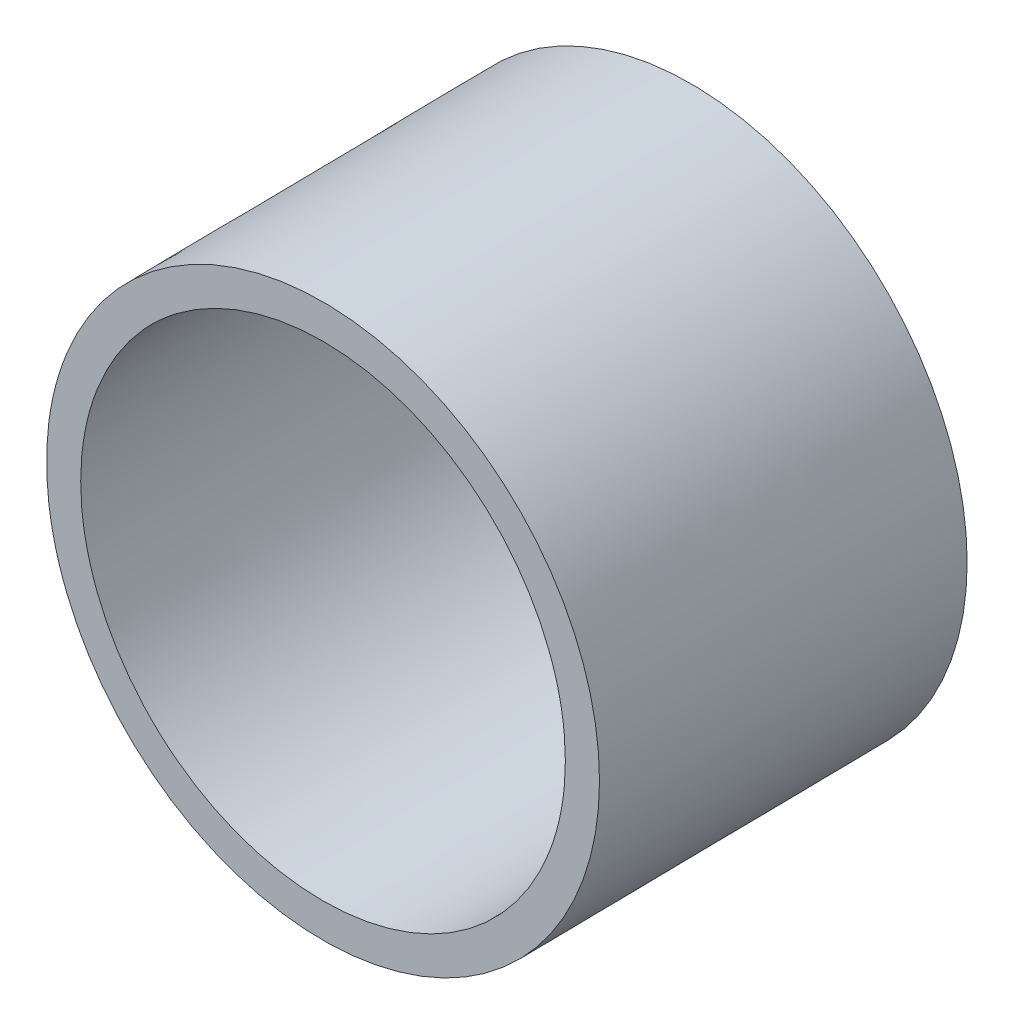
ISO-10303-21;
HEADER;
FILE_DESCRIPTION(('STEP AP214'),'2;1');
FILE_NAME('part.step','',(''),(''),'','','');
FILE_SCHEMA(('AUTOMOTIVE_DESIGN { 1 0 10303 214 1 1 1 1 }'));
ENDSEC;
DATA;
#1=APPLICATION_CONTEXT('core data for automotive mechanical design processes');
#2=APPLICATION_PROTOCOL_DEFINITION('international standard','automotive_design',2000,#1);
#3=PRODUCT_CONTEXT('',#1,'mechanical');
#4=PRODUCT('Part','Part','',(#3));
#5=PRODUCT_RELATED_PRODUCT_CATEGORY('part','',(#4));
#6=PRODUCT_DEFINITION_FORMATION('','',#4);
#7=PRODUCT_DEFINITION_CONTEXT('part definition',#1,'design');
#8=PRODUCT_DEFINITION('design','',#6,#7);
#9=PRODUCT_DEFINITION_SHAPE('','',#8);
#10=(LENGTH_UNIT() NAMED_UNIT(*) SI_UNIT(.MILLI.,.METRE.));
#11=(NAMED_UNIT(*) PLANE_ANGLE_UNIT() SI_UNIT($,.RADIAN.));
#12=(NAMED_UNIT(*) SI_UNIT($,.STERADIAN.) SOLID_ANGLE_UNIT());
#13=UNCERTAINTY_MEASURE_WITH_UNIT(LENGTH_MEASURE(1.E-05),#10,'distance_accuracy_value','');
#14=(GEOMETRIC_REPRESENTATION_CONTEXT(3) GLOBAL_UNCERTAINTY_ASSIGNED_CONTEXT((#13)) GLOBAL_UNIT_ASSIGNED_CONTEXT((#10,
#11,#12)) REPRESENTATION_CONTEXT('',''));
#15=CARTESIAN_POINT('',(0.,0.,0.));
#16=DIRECTION('',(0.,0.,1.));
#17=DIRECTION('',(1.,0.,0.));
#18=AXIS2_PLACEMENT_3D('',#15,#16,#17);
#19=CARTESIAN_POINT('',(0.,-0.847223824919752,59.1136319419832));
#20=DIRECTION('',(0.,0.,1.));
#21=DIRECTION('',(1.,0.,0.));
#22=AXIS2_PLACEMENT_3D('',#19,#20,#21);
#23=PLANE('',#22);
#24=CARTESIAN_POINT('',(0.,-0.847223824919752,59.1136319419832));
#25=DIRECTION('',(0.,0.,1.));
#26=DIRECTION('',(1.,0.,0.));
#27=AXIS2_PLACEMENT_3D('',#24,#25,#26);
#28=CIRCLE('',#27,38.9636);
#29=CARTESIAN_POINT('',(38.9636,-0.847223824919752,59.1136319419832));
#30=VERTEX_POINT('',#29);
#31=EDGE_CURVE('E51',#30,#30,#28,.T.);
#32=ORIENTED_EDGE('',*,*,#31,.F.);
#33=EDGE_LOOP('',(#32));
#34=FACE_BOUND('',#33,.T.);
#35=CARTESIAN_POINT('',(0.,-0.847223824919752,59.1136319419832));
#36=DIRECTION('',(0.,0.,1.));
#37=DIRECTION('',(1.,0.,0.));
#38=AXIS2_PLACEMENT_3D('',#35,#36,#37);
#39=CIRCLE('',#38,44.45);
#40=CARTESIAN_POINT('',(44.45,-0.847223824919752,59.1136319419832));
#41=VERTEX_POINT('',#40);
#42=EDGE_CURVE('E47',#41,#41,#39,.T.);
#43=ORIENTED_EDGE('',*,*,#42,.T.);
#44=EDGE_LOOP('',(#43));
#45=FACE_BOUND('',#44,.T.);
#46=ADVANCED_FACE('F36',(#34,#45),#23,.T.);
#47=CARTESIAN_POINT('',(0.,0.,0.));
#48=DIRECTION('',(0.,0.,1.));
#49=DIRECTION('',(1.,0.,0.));
#50=AXIS2_PLACEMENT_3D('',#47,#48,#49);
#51=PLANE('',#50);
#52=CARTESIAN_POINT('',(0.,0.,0.));
#53=DIRECTION('',(0.,0.,1.));
#54=DIRECTION('',(1.,0.,0.));
#55=AXIS2_PLACEMENT_3D('',#52,#53,#54);
#56=CIRCLE('',#55,38.9636);
#57=CARTESIAN_POINT('',(38.9636,0.,0.));
#58=VERTEX_POINT('',#57);
#59=EDGE_CURVE('E43',#58,#58,#56,.T.);
#60=ORIENTED_EDGE('',*,*,#59,.T.);
#61=EDGE_LOOP('',(#60));
#62=FACE_BOUND('',#61,.T.);
#63=CARTESIAN_POINT('',(0.,0.,0.));
#64=DIRECTION('',(0.,0.,1.));
#65=DIRECTION('',(1.,0.,0.));
#66=AXIS2_PLACEMENT_3D('',#63,#64,#65);
#67=CIRCLE('',#66,44.45);
#68=CARTESIAN_POINT('',(44.45,0.,0.));
#69=VERTEX_POINT('',#68);
#70=EDGE_CURVE('E10',#69,#69,#67,.T.);
#71=ORIENTED_EDGE('',*,*,#70,.F.);
#72=EDGE_LOOP('',(#71));
#73=FACE_BOUND('',#72,.T.);
#74=ADVANCED_FACE('F38',(#62,#73),#51,.F.);
#75=CARTESIAN_POINT('',(44.45,0.,0.));
#76=CARTESIAN_POINT('',(44.45,-0.847223824919752,59.1136319419832));
#77=CARTESIAN_POINT('',(44.45,-88.9,0.));
#78=CARTESIAN_POINT('',(44.45,-89.7472238249197,59.1136319419832));
#79=CARTESIAN_POINT('',(-44.45,-88.9,0.));
#80=CARTESIAN_POINT('',(-44.45,-89.7472238249197,59.1136319419832));
#81=CARTESIAN_POINT('',(-44.45,0.,0.));
#82=CARTESIAN_POINT('',(-44.45,-0.847223824919746,59.1136319419832));
#83=CARTESIAN_POINT('',(-44.45,88.9,0.));
#84=CARTESIAN_POINT('',(-44.45,88.0527761750802,59.1136319419832));
#85=CARTESIAN_POINT('',(44.45,88.9,0.));
#86=CARTESIAN_POINT('',(44.45,88.0527761750802,59.1136319419832));
#87=CARTESIAN_POINT('',(44.45,0.,0.));
#88=CARTESIAN_POINT('',(44.45,-0.847223824919752,59.1136319419832));
#89=(BOUNDED_SURFACE() B_SPLINE_SURFACE(3,1,((#75,#76),(#77,#78),(#79,#80),(#81,#82),(#83,#84),
(#85,#86),(#87,#88)),.UNSPECIFIED.,.T.,.F.,.F.) B_SPLINE_SURFACE_WITH_KNOTS((4,3,4),(2,2),(0.,
0.5,1.),(0.,1.),.UNSPECIFIED.) GEOMETRIC_REPRESENTATION_ITEM() RATIONAL_B_SPLINE_SURFACE(((1.,
1.),(0.333333333333333,0.333333333333333),(0.333333333333333,0.333333333333333),(1.,1.),
(0.333333333333333,0.333333333333333),(0.333333333333333,0.333333333333333),(1.,1.))) REPRESENTATION_ITEM('') SURFACE());
#90=CARTESIAN_POINT('',(44.45,0.,0.));
#91=CARTESIAN_POINT('',(44.45,-0.00882524817624742,0.615766999395658));
#92=CARTESIAN_POINT('',(44.45,-0.0176504963524948,1.23153399879132));
#93=CARTESIAN_POINT('',(44.45,-0.0353009927049897,2.46306799758263));
#94=CARTESIAN_POINT('',(44.45,-0.0441262408812371,3.07883499697829));
#95=CARTESIAN_POINT('',(44.45,-0.0617767372337319,4.31036899576961));
#96=CARTESIAN_POINT('',(44.45,-0.0706019854099793,4.92613599516526));
#97=CARTESIAN_POINT('',(44.45,-0.0882524817624741,6.15766999395658));
#98=CARTESIAN_POINT('',(44.45,-0.0970777299387215,6.77343699335224));
#99=CARTESIAN_POINT('',(44.45,-0.114728226291216,8.00497099214355));
#100=CARTESIAN_POINT('',(44.45,-0.123553474467464,8.62073799153921));
#101=CARTESIAN_POINT('',(44.45,-0.141203970819959,9.85227199033053));
#102=CARTESIAN_POINT('',(44.45,-0.150029218996206,10.4680389897262));
#103=CARTESIAN_POINT('',(44.45,-0.167679715348701,11.6995729885175));
#104=CARTESIAN_POINT('',(44.45,-0.176504963524948,12.3153399879132));
#105=CARTESIAN_POINT('',(44.45,-0.194155459877443,13.5468739867045));
#106=CARTESIAN_POINT('',(44.45,-0.202980708053691,14.1626409861001));
#107=CARTESIAN_POINT('',(44.45,-0.220631204406185,15.3941749848914));
#108=CARTESIAN_POINT('',(44.45,-0.229456452582433,16.0099419842871));
#109=CARTESIAN_POINT('',(44.45,-0.247106948934928,17.2414759830784));
#110=CARTESIAN_POINT('',(44.45,-0.255932197111175,17.8572429824741));
#111=CARTESIAN_POINT('',(44.45,-0.27358269346367,19.0887769812654));
#112=CARTESIAN_POINT('',(44.45,-0.282407941639917,19.7045439806611));
#113=CARTESIAN_POINT('',(44.45,-0.300058437992412,20.9360779794524));
#114=CARTESIAN_POINT('',(44.45,-0.308883686168659,21.551844978848));
#115=CARTESIAN_POINT('',(44.45,-0.326534182521154,22.7833789776393));
#116=CARTESIAN_POINT('',(44.45,-0.335359430697402,23.399145977035));
#117=CARTESIAN_POINT('',(44.45,-0.353009927049897,24.6306799758263));
#118=CARTESIAN_POINT('',(44.45,-0.361835175226144,25.246446975222));
#119=CARTESIAN_POINT('',(44.45,-0.379485671578639,26.4779809740133));
#120=CARTESIAN_POINT('',(44.45,-0.388310919754886,27.0937479734089));
#121=CARTESIAN_POINT('',(44.45,-0.405961416107381,28.3252819722003));
#122=CARTESIAN_POINT('',(44.45,-0.414786664283628,28.9410489715959));
#123=CARTESIAN_POINT('',(44.45,-0.432437160636123,30.1725829703872));
#124=CARTESIAN_POINT('',(44.45,-0.441262408812371,30.7883499697829));
#125=CARTESIAN_POINT('',(44.45,-0.458912905164865,32.0198839685742));
#126=CARTESIAN_POINT('',(44.45,-0.467738153341113,32.6356509679699));
#127=CARTESIAN_POINT('',(44.45,-0.485388649693608,33.8671849667612));
#128=CARTESIAN_POINT('',(44.45,-0.494213897869855,34.4829519661568));
#129=CARTESIAN_POINT('',(44.45,-0.51186439422235,35.7144859649482));
#130=CARTESIAN_POINT('',(44.45,-0.520689642398597,36.3302529643438));
#131=CARTESIAN_POINT('',(44.45,-0.538340138751092,37.5617869631351));
#132=CARTESIAN_POINT('',(44.45,-0.54716538692734,38.1775539625308));
#133=CARTESIAN_POINT('',(44.45,-0.564815883279834,39.4090879613221));
#134=CARTESIAN_POINT('',(44.45,-0.573641131456082,40.0248549607178));
#135=CARTESIAN_POINT('',(44.45,-0.591291627808577,41.2563889595091));
#136=CARTESIAN_POINT('',(44.45,-0.600116875984824,41.8721559589047));
#137=CARTESIAN_POINT('',(44.45,-0.617767372337319,43.1036899576961));
#138=CARTESIAN_POINT('',(44.45,-0.626592620513566,43.7194569570917));
#139=CARTESIAN_POINT('',(44.45,-0.644243116866061,44.950990955883));
#140=CARTESIAN_POINT('',(44.45,-0.653068365042309,45.5667579552787));
#141=CARTESIAN_POINT('',(44.45,-0.670718861394803,46.79829195407));
#142=CARTESIAN_POINT('',(44.45,-0.679544109571051,47.4140589534657));
#143=CARTESIAN_POINT('',(44.45,-0.697194605923546,48.645592952257));
#144=CARTESIAN_POINT('',(44.45,-0.706019854099793,49.2613599516526));
#145=CARTESIAN_POINT('',(44.45,-0.723670350452288,50.4928939504439));
#146=CARTESIAN_POINT('',(44.45,-0.732495598628535,51.1086609498396));
#147=CARTESIAN_POINT('',(44.45,-0.75014609498103,52.3401949486309));
#148=CARTESIAN_POINT('',(44.45,-0.758971343157278,52.9559619480266));
#149=CARTESIAN_POINT('',(44.45,-0.776621839509772,54.1874959468179));
#150=CARTESIAN_POINT('',(44.45,-0.78544708768602,54.8032629462136));
#151=CARTESIAN_POINT('',(44.45,-0.803097584038515,56.0347969450049));
#152=CARTESIAN_POINT('',(44.45,-0.811922832214762,56.6505639444005));
#153=CARTESIAN_POINT('',(44.45,-0.829573328567257,57.8820979431918));
#154=CARTESIAN_POINT('',(44.45,-0.838398576743504,58.4978649425875));
#155=CARTESIAN_POINT('',(44.45,-0.847223824919752,59.1136319419832));
#156=B_SPLINE_CURVE_WITH_KNOTS('',3,(#90,#91,#92,#93,#94,#95,#96,#97,#98,#99,#100,#101,#102,
#103,#104,#105,#106,#107,#108,#109,#110,#111,#112,#113,#114,#115,#116,#117,#118,#119,#120,#121,
#122,#123,#124,#125,#126,#127,#128,#129,#130,#131,#132,#133,#134,#135,#136,#137,#138,#139,#140,
#141,#142,#143,#144,#145,#146,#147,#148,#149,#150,#151,#152,#153,#154,#155),.UNSPECIFIED.,.F.,
.F.,(4,2,2,2,2,2,2,2,2,2,2,2,2,2,2,2,2,2,2,2,2,2,2,2,2,2,2,2,2,2,2,2,4),(0.,1.84749071525433,
3.69498143050865,5.54247214576298,7.3899628610173,9.23745357627163,11.084944291526,
12.9324350067803,14.7799257220346,16.6274164372889,18.4749071525433,20.3223978677976,
22.1698885830519,24.0173792983062,25.8648700135606,27.7123607288149,29.5598514440692,
31.4073421593235,33.2548328745779,35.1023235898322,36.9498143050865,38.7973050203408,
40.6447957355952,42.4922864508495,44.3397771661038,46.1872678813582,48.0347585966125,
49.8822493118668,51.7297400271211,53.5772307423755,55.4247214576298,57.2722121728841,
59.1197028881385),.UNSPECIFIED.);
#157=EDGE_CURVE('BSEAM64',#69,#41,#156,.T.);
#158=ORIENTED_EDGE('',*,*,#70,.T.);
#159=ORIENTED_EDGE('',*,*,#42,.F.);
#160=ORIENTED_EDGE('',*,*,#157,.T.);
#161=ORIENTED_EDGE('',*,*,#157,.F.);
#162=EDGE_LOOP('',(#158,#160,#159,#161));
#163=FACE_BOUND('',#162,.T.);
#164=ADVANCED_FACE('F64',(#163),#89,.F.);
#165=CARTESIAN_POINT('',(38.9636,0.,0.));
#166=CARTESIAN_POINT('',(38.9636,-0.847223824919752,59.1136319419832));
#167=CARTESIAN_POINT('',(38.9636,-77.9272,0.));
#168=CARTESIAN_POINT('',(38.9636,-78.7744238249197,59.1136319419832));
#169=CARTESIAN_POINT('',(-38.9636,-77.9272,0.));
#170=CARTESIAN_POINT('',(-38.9636,-78.7744238249197,59.1136319419832));
#171=CARTESIAN_POINT('',(-38.9636,0.,0.));
#172=CARTESIAN_POINT('',(-38.9636,-0.847223824919747,59.1136319419832));
#173=CARTESIAN_POINT('',(-38.9636,77.9272,0.));
#174=CARTESIAN_POINT('',(-38.9636,77.0799761750802,59.1136319419832));
#175=CARTESIAN_POINT('',(38.9636,77.9272,0.));
#176=CARTESIAN_POINT('',(38.9636,77.0799761750802,59.1136319419832));
#177=CARTESIAN_POINT('',(38.9636,0.,0.));
#178=CARTESIAN_POINT('',(38.9636,-0.847223824919752,59.1136319419832));
#179=(BOUNDED_SURFACE() B_SPLINE_SURFACE(3,1,((#165,#166),(#167,#168),(#169,#170),(#171,#172),
(#173,#174),(#175,#176),(#177,#178)),.UNSPECIFIED.,.T.,.F.,.F.) B_SPLINE_SURFACE_WITH_KNOTS((4,
3,4),(2,2),(0.,0.5,1.),(0.,1.),
.UNSPECIFIED.) GEOMETRIC_REPRESENTATION_ITEM() RATIONAL_B_SPLINE_SURFACE(((1.,1.),
(0.333333333333333,0.333333333333333),(0.333333333333333,0.333333333333333),(1.,1.),
(0.333333333333333,0.333333333333333),(0.333333333333333,0.333333333333333),(1.,1.))) REPRESENTATION_ITEM('') SURFACE());
#180=CARTESIAN_POINT('',(38.9636,0.,0.));
#181=CARTESIAN_POINT('',(38.9636,-0.00882524817624742,0.615766999395658));
#182=CARTESIAN_POINT('',(38.9636,-0.0176504963524948,1.23153399879132));
#183=CARTESIAN_POINT('',(38.9636,-0.0353009927049897,2.46306799758263));
#184=CARTESIAN_POINT('',(38.9636,-0.0441262408812371,3.07883499697829));
#185=CARTESIAN_POINT('',(38.9636,-0.0617767372337319,4.31036899576961));
#186=CARTESIAN_POINT('',(38.9636,-0.0706019854099793,4.92613599516526));
#187=CARTESIAN_POINT('',(38.9636,-0.0882524817624741,6.15766999395658));
#188=CARTESIAN_POINT('',(38.9636,-0.0970777299387215,6.77343699335224));
#189=CARTESIAN_POINT('',(38.9636,-0.114728226291216,8.00497099214355));
#190=CARTESIAN_POINT('',(38.9636,-0.123553474467464,8.62073799153921));
#191=CARTESIAN_POINT('',(38.9636,-0.141203970819959,9.85227199033053));
#192=CARTESIAN_POINT('',(38.9636,-0.150029218996206,10.4680389897262));
#193=CARTESIAN_POINT('',(38.9636,-0.167679715348701,11.6995729885175));
#194=CARTESIAN_POINT('',(38.9636,-0.176504963524948,12.3153399879132));
#195=CARTESIAN_POINT('',(38.9636,-0.194155459877443,13.5468739867045));
#196=CARTESIAN_POINT('',(38.9636,-0.202980708053691,14.1626409861001));
#197=CARTESIAN_POINT('',(38.9636,-0.220631204406185,15.3941749848914));
#198=CARTESIAN_POINT('',(38.9636,-0.229456452582433,16.0099419842871));
#199=CARTESIAN_POINT('',(38.9636,-0.247106948934928,17.2414759830784));
#200=CARTESIAN_POINT('',(38.9636,-0.255932197111175,17.8572429824741));
#201=CARTESIAN_POINT('',(38.9636,-0.27358269346367,19.0887769812654));
#202=CARTESIAN_POINT('',(38.9636,-0.282407941639917,19.7045439806611));
#203=CARTESIAN_POINT('',(38.9636,-0.300058437992412,20.9360779794524));
#204=CARTESIAN_POINT('',(38.9636,-0.308883686168659,21.551844978848));
#205=CARTESIAN_POINT('',(38.9636,-0.326534182521154,22.7833789776393));
#206=CARTESIAN_POINT('',(38.9636,-0.335359430697402,23.399145977035));
#207=CARTESIAN_POINT('',(38.9636,-0.353009927049897,24.6306799758263));
#208=CARTESIAN_POINT('',(38.9636,-0.361835175226144,25.246446975222));
#209=CARTESIAN_POINT('',(38.9636,-0.379485671578639,26.4779809740133));
#210=CARTESIAN_POINT('',(38.9636,-0.388310919754886,27.0937479734089));
#211=CARTESIAN_POINT('',(38.9636,-0.405961416107381,28.3252819722003));
#212=CARTESIAN_POINT('',(38.9636,-0.414786664283628,28.9410489715959));
#213=CARTESIAN_POINT('',(38.9636,-0.432437160636123,30.1725829703872));
#214=CARTESIAN_POINT('',(38.9636,-0.441262408812371,30.7883499697829));
#215=CARTESIAN_POINT('',(38.9636,-0.458912905164865,32.0198839685742));
#216=CARTESIAN_POINT('',(38.9636,-0.467738153341113,32.6356509679699));
#217=CARTESIAN_POINT('',(38.9636,-0.485388649693608,33.8671849667612));
#218=CARTESIAN_POINT('',(38.9636,-0.494213897869855,34.4829519661568));
#219=CARTESIAN_POINT('',(38.9636,-0.51186439422235,35.7144859649482));
#220=CARTESIAN_POINT('',(38.9636,-0.520689642398597,36.3302529643438));
#221=CARTESIAN_POINT('',(38.9636,-0.538340138751092,37.5617869631351));
#222=CARTESIAN_POINT('',(38.9636,-0.54716538692734,38.1775539625308));
#223=CARTESIAN_POINT('',(38.9636,-0.564815883279834,39.4090879613221));
#224=CARTESIAN_POINT('',(38.9636,-0.573641131456082,40.0248549607178));
#225=CARTESIAN_POINT('',(38.9636,-0.591291627808577,41.2563889595091));
#226=CARTESIAN_POINT('',(38.9636,-0.600116875984824,41.8721559589047));
#227=CARTESIAN_POINT('',(38.9636,-0.617767372337319,43.1036899576961));
#228=CARTESIAN_POINT('',(38.9636,-0.626592620513566,43.7194569570917));
#229=CARTESIAN_POINT('',(38.9636,-0.644243116866061,44.950990955883));
#230=CARTESIAN_POINT('',(38.9636,-0.653068365042309,45.5667579552787));
#231=CARTESIAN_POINT('',(38.9636,-0.670718861394803,46.79829195407));
#232=CARTESIAN_POINT('',(38.9636,-0.679544109571051,47.4140589534657));
#233=CARTESIAN_POINT('',(38.9636,-0.697194605923546,48.645592952257));
#234=CARTESIAN_POINT('',(38.9636,-0.706019854099793,49.2613599516526));
#235=CARTESIAN_POINT('',(38.9636,-0.723670350452288,50.4928939504439));
#236=CARTESIAN_POINT('',(38.9636,-0.732495598628535,51.1086609498396));
#237=CARTESIAN_POINT('',(38.9636,-0.75014609498103,52.3401949486309));
#238=CARTESIAN_POINT('',(38.9636,-0.758971343157278,52.9559619480266));
#239=CARTESIAN_POINT('',(38.9636,-0.776621839509772,54.1874959468179));
#240=CARTESIAN_POINT('',(38.9636,-0.78544708768602,54.8032629462136));
#241=CARTESIAN_POINT('',(38.9636,-0.803097584038515,56.0347969450049));
#242=CARTESIAN_POINT('',(38.9636,-0.811922832214762,56.6505639444005));
#243=CARTESIAN_POINT('',(38.9636,-0.829573328567257,57.8820979431918));
#244=CARTESIAN_POINT('',(38.9636,-0.838398576743504,58.4978649425875));
#245=CARTESIAN_POINT('',(38.9636,-0.847223824919752,59.1136319419832));
#246=B_SPLINE_CURVE_WITH_KNOTS('',3,(#180,#181,#182,#183,#184,#185,#186,#187,#188,#189,#190,
#191,#192,#193,#194,#195,#196,#197,#198,#199,#200,#201,#202,#203,#204,#205,#206,#207,#208,#209,
#210,#211,#212,#213,#214,#215,#216,#217,#218,#219,#220,#221,#222,#223,#224,#225,#226,#227,#228,
#229,#230,#231,#232,#233,#234,#235,#236,#237,#238,#239,#240,#241,#242,#243,#244,#245),
.UNSPECIFIED.,.F.,.F.,(4,2,2,2,2,2,2,2,2,2,2,2,2,2,2,2,2,2,2,2,2,2,2,2,2,2,2,2,2,2,2,2,4),(0.,
1.84749071525433,3.69498143050865,5.54247214576298,7.3899628610173,9.23745357627163,
11.084944291526,12.9324350067803,14.7799257220346,16.6274164372889,18.4749071525433,
20.3223978677976,22.1698885830519,24.0173792983062,25.8648700135606,27.7123607288149,
29.5598514440692,31.4073421593235,33.2548328745779,35.1023235898322,36.9498143050865,
38.7973050203408,40.6447957355952,42.4922864508495,44.3397771661038,46.1872678813582,
48.0347585966125,49.8822493118668,51.7297400271211,53.5772307423755,55.4247214576298,
57.2722121728841,59.1197028881385),.UNSPECIFIED.);
#247=EDGE_CURVE('BSEAM57',#58,#30,#246,.T.);
#248=ORIENTED_EDGE('',*,*,#59,.F.);
#249=ORIENTED_EDGE('',*,*,#31,.T.);
#250=ORIENTED_EDGE('',*,*,#247,.T.);
#251=ORIENTED_EDGE('',*,*,#247,.F.);
#252=EDGE_LOOP('',(#248,#250,#249,#251));
#253=FACE_BOUND('',#252,.T.);
#254=ADVANCED_FACE('F57',(#253),#179,.T.);
#255=CLOSED_SHELL('',(#46,#74,#164,#254));
#256=MANIFOLD_SOLID_BREP('B2',#255);
#257=ADVANCED_BREP_SHAPE_REPRESENTATION('',(#18,#256),#14);
#258=SHAPE_DEFINITION_REPRESENTATION(#9,#257);
ENDSEC;
END-ISO-10303-21;
